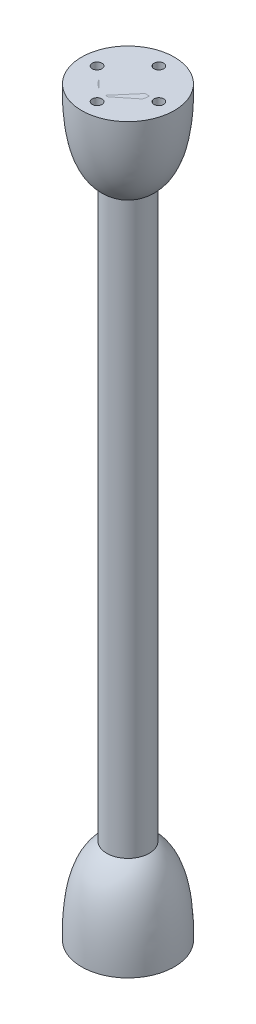
ISO-10303-21;
HEADER;
FILE_DESCRIPTION(('STEP AP214'),'2;1');
FILE_NAME('part.step','',(''),(''),'','','');
FILE_SCHEMA(('AUTOMOTIVE_DESIGN { 1 0 10303 214 1 1 1 1 }'));
ENDSEC;
DATA;
#1=APPLICATION_CONTEXT('core data for automotive mechanical design processes');
#2=APPLICATION_PROTOCOL_DEFINITION('international standard','automotive_design',2000,#1);
#3=PRODUCT_CONTEXT('',#1,'mechanical');
#4=PRODUCT('Part','Part','',(#3));
#5=PRODUCT_RELATED_PRODUCT_CATEGORY('part','',(#4));
#6=PRODUCT_DEFINITION_FORMATION('','',#4);
#7=PRODUCT_DEFINITION_CONTEXT('part definition',#1,'design');
#8=PRODUCT_DEFINITION('design','',#6,#7);
#9=PRODUCT_DEFINITION_SHAPE('','',#8);
#10=(LENGTH_UNIT() NAMED_UNIT(*) SI_UNIT(.MILLI.,.METRE.));
#11=(NAMED_UNIT(*) PLANE_ANGLE_UNIT() SI_UNIT($,.RADIAN.));
#12=(NAMED_UNIT(*) SI_UNIT($,.STERADIAN.) SOLID_ANGLE_UNIT());
#13=UNCERTAINTY_MEASURE_WITH_UNIT(LENGTH_MEASURE(1.E-05),#10,'distance_accuracy_value','');
#14=(GEOMETRIC_REPRESENTATION_CONTEXT(3) GLOBAL_UNCERTAINTY_ASSIGNED_CONTEXT((#13)) GLOBAL_UNIT_ASSIGNED_CONTEXT((#10,
#11,#12)) REPRESENTATION_CONTEXT('',''));
#15=CARTESIAN_POINT('',(0.,0.,0.));
#16=DIRECTION('',(0.,0.,1.));
#17=DIRECTION('',(1.,0.,0.));
#18=AXIS2_PLACEMENT_3D('',#15,#16,#17);
#19=CARTESIAN_POINT('',(0.,266.7,0.));
#20=CARTESIAN_POINT('',(19.7530600429032,267.671645918133,0.));
#21=CARTESIAN_POINT('',(19.05,304.8,0.));
#22=B_SPLINE_CURVE_WITH_KNOTS('',2,(#19,#20,#21),.UNSPECIFIED.,.F.,.F.,(3,3),(0.,1.),.UNSPECIFIED.);
#23=CARTESIAN_POINT('',(0.,0.,0.));
#24=DIRECTION('',(0.,-1.,0.));
#25=AXIS1_PLACEMENT('',#23,#24);
#26=SURFACE_OF_REVOLUTION('',#22,#25);
#27=CARTESIAN_POINT('',(0.,304.8,0.));
#28=DIRECTION('',(0.,-1.,0.));
#29=DIRECTION('',(0.,0.,-1.));
#30=AXIS2_PLACEMENT_3D('',#27,#28,#29);
#31=CIRCLE('',#30,19.05);
#32=CARTESIAN_POINT('',(0.,304.8,-19.05));
#33=VERTEX_POINT('',#32);
#34=EDGE_CURVE('E12',#33,#33,#31,.T.);
#35=ORIENTED_EDGE('',*,*,#34,.T.);
#36=EDGE_LOOP('',(#35));
#37=FACE_BOUND('',#36,.T.);
#38=CARTESIAN_POINT('',(0.,266.7,0.));
#39=VERTEX_POINT('',#38);
#40=VERTEX_LOOP('',#39);
#41=FACE_BOUND('',#40,.T.);
#42=ADVANCED_FACE('F47',(#37,#41),#26,.F.);
#43=CARTESIAN_POINT('',(0.,304.8,0.));
#44=DIRECTION('',(0.,1.,0.));
#45=DIRECTION('',(0.,0.,1.));
#46=AXIS2_PLACEMENT_3D('',#43,#44,#45);
#47=PLANE('',#46);
#48=CARTESIAN_POINT('',(12.7,304.8,0.));
#49=DIRECTION('',(0.,1.,0.));
#50=DIRECTION('',(0.,0.,1.));
#51=AXIS2_PLACEMENT_3D('',#48,#49,#50);
#52=CIRCLE('',#51,2.000000064);
#53=CARTESIAN_POINT('',(12.7,304.8,2.000000064));
#54=VERTEX_POINT('',#53);
#55=EDGE_CURVE('E105',#54,#54,#52,.T.);
#56=ORIENTED_EDGE('',*,*,#55,.F.);
#57=EDGE_LOOP('',(#56));
#58=FACE_BOUND('',#57,.T.);
#59=CARTESIAN_POINT('',(-12.7,304.8,0.));
#60=DIRECTION('',(0.,1.,0.));
#61=DIRECTION('',(0.,0.,1.));
#62=AXIS2_PLACEMENT_3D('',#59,#60,#61);
#63=CIRCLE('',#62,2.000000064);
#64=CARTESIAN_POINT('',(-12.7,304.8,2.000000064));
#65=VERTEX_POINT('',#64);
#66=EDGE_CURVE('E108',#65,#65,#63,.T.);
#67=ORIENTED_EDGE('',*,*,#66,.F.);
#68=EDGE_LOOP('',(#67));
#69=FACE_BOUND('',#68,.T.);
#70=CARTESIAN_POINT('',(0.,304.8,-12.7));
#71=DIRECTION('',(0.,1.,0.));
#72=DIRECTION('',(0.,0.,1.));
#73=AXIS2_PLACEMENT_3D('',#70,#71,#72);
#74=CIRCLE('',#73,2.000000064);
#75=CARTESIAN_POINT('',(0.,304.8,-10.699999936));
#76=VERTEX_POINT('',#75);
#77=EDGE_CURVE('E116',#76,#76,#74,.T.);
#78=ORIENTED_EDGE('',*,*,#77,.F.);
#79=EDGE_LOOP('',(#78));
#80=FACE_BOUND('',#79,.T.);
#81=CARTESIAN_POINT('',(0.,304.8,12.7));
#82=DIRECTION('',(0.,1.,0.));
#83=DIRECTION('',(0.,0.,1.));
#84=AXIS2_PLACEMENT_3D('',#81,#82,#83);
#85=CIRCLE('',#84,2.000000064);
#86=CARTESIAN_POINT('',(0.,304.8,14.700000064));
#87=VERTEX_POINT('',#86);
#88=EDGE_CURVE('E122',#87,#87,#85,.T.);
#89=ORIENTED_EDGE('',*,*,#88,.F.);
#90=EDGE_LOOP('',(#89));
#91=FACE_BOUND('',#90,.T.);
#92=ORIENTED_EDGE('',*,*,#34,.F.);
#93=EDGE_LOOP('',(#92));
#94=FACE_BOUND('',#93,.T.);
#95=ADVANCED_FACE('F57',(#58,#69,#80,#91,#94),#47,.T.);
#96=CARTESIAN_POINT('',(0.,297.80000003,12.7));
#97=DIRECTION('',(0.,1.,0.));
#98=DIRECTION('',(0.,0.,1.));
#99=AXIS2_PLACEMENT_3D('',#96,#97,#98);
#100=CYLINDRICAL_SURFACE('',#99,2.000000064);
#101=CARTESIAN_POINT('',(0.,297.80000003,12.7));
#102=DIRECTION('',(0.,1.,0.));
#103=DIRECTION('',(0.,0.,1.));
#104=AXIS2_PLACEMENT_3D('',#101,#102,#103);
#105=CIRCLE('',#104,2.000000064);
#106=CARTESIAN_POINT('',(0.,297.80000003,14.700000064));
#107=VERTEX_POINT('',#106);
#108=EDGE_CURVE('E125',#107,#107,#105,.T.);
#109=ORIENTED_EDGE('',*,*,#108,.F.);
#110=EDGE_LOOP('',(#109));
#111=FACE_BOUND('',#110,.T.);
#112=ORIENTED_EDGE('',*,*,#88,.T.);
#113=EDGE_LOOP('',(#112));
#114=FACE_BOUND('',#113,.T.);
#115=ADVANCED_FACE('F62',(#111,#114),#100,.F.);
#116=CARTESIAN_POINT('',(0.,297.80000003,12.7));
#117=DIRECTION('',(0.,1.,0.));
#118=DIRECTION('',(0.,0.,1.));
#119=AXIS2_PLACEMENT_3D('',#116,#117,#118);
#120=PLANE('',#119);
#121=ORIENTED_EDGE('',*,*,#108,.T.);
#122=EDGE_LOOP('',(#121));
#123=FACE_BOUND('',#122,.T.);
#124=ADVANCED_FACE('F69',(#123),#120,.T.);
#125=CARTESIAN_POINT('',(0.,297.80000003,-12.7));
#126=DIRECTION('',(0.,1.,0.));
#127=DIRECTION('',(0.,0.,1.));
#128=AXIS2_PLACEMENT_3D('',#125,#126,#127);
#129=CYLINDRICAL_SURFACE('',#128,2.000000064);
#130=CARTESIAN_POINT('',(0.,297.80000003,-12.7));
#131=DIRECTION('',(0.,1.,0.));
#132=DIRECTION('',(0.,0.,1.));
#133=AXIS2_PLACEMENT_3D('',#130,#131,#132);
#134=CIRCLE('',#133,2.000000064);
#135=CARTESIAN_POINT('',(0.,297.80000003,-10.699999936));
#136=VERTEX_POINT('',#135);
#137=EDGE_CURVE('E119',#136,#136,#134,.T.);
#138=ORIENTED_EDGE('',*,*,#137,.F.);
#139=EDGE_LOOP('',(#138));
#140=FACE_BOUND('',#139,.T.);
#141=ORIENTED_EDGE('',*,*,#77,.T.);
#142=EDGE_LOOP('',(#141));
#143=FACE_BOUND('',#142,.T.);
#144=ADVANCED_FACE('F76',(#140,#143),#129,.F.);
#145=CARTESIAN_POINT('',(0.,297.80000003,-12.7));
#146=DIRECTION('',(0.,1.,0.));
#147=DIRECTION('',(0.,0.,1.));
#148=AXIS2_PLACEMENT_3D('',#145,#146,#147);
#149=PLANE('',#148);
#150=ORIENTED_EDGE('',*,*,#137,.T.);
#151=EDGE_LOOP('',(#150));
#152=FACE_BOUND('',#151,.T.);
#153=ADVANCED_FACE('F79',(#152),#149,.T.);
#154=CARTESIAN_POINT('',(-12.7,297.80000003,0.));
#155=DIRECTION('',(0.,1.,0.));
#156=DIRECTION('',(0.,0.,1.));
#157=AXIS2_PLACEMENT_3D('',#154,#155,#156);
#158=CYLINDRICAL_SURFACE('',#157,2.000000064);
#159=CARTESIAN_POINT('',(-12.7,297.80000003,0.));
#160=DIRECTION('',(0.,1.,0.));
#161=DIRECTION('',(0.,0.,1.));
#162=AXIS2_PLACEMENT_3D('',#159,#160,#161);
#163=CIRCLE('',#162,2.000000064);
#164=CARTESIAN_POINT('',(-12.7,297.80000003,2.000000064));
#165=VERTEX_POINT('',#164);
#166=EDGE_CURVE('E113',#165,#165,#163,.T.);
#167=ORIENTED_EDGE('',*,*,#166,.F.);
#168=EDGE_LOOP('',(#167));
#169=FACE_BOUND('',#168,.T.);
#170=ORIENTED_EDGE('',*,*,#66,.T.);
#171=EDGE_LOOP('',(#170));
#172=FACE_BOUND('',#171,.T.);
#173=ADVANCED_FACE('F82',(#169,#172),#158,.F.);
#174=CARTESIAN_POINT('',(-12.7,297.80000003,0.));
#175=DIRECTION('',(0.,1.,0.));
#176=DIRECTION('',(0.,0.,1.));
#177=AXIS2_PLACEMENT_3D('',#174,#175,#176);
#178=PLANE('',#177);
#179=ORIENTED_EDGE('',*,*,#166,.T.);
#180=EDGE_LOOP('',(#179));
#181=FACE_BOUND('',#180,.T.);
#182=ADVANCED_FACE('F87',(#181),#178,.T.);
#183=CARTESIAN_POINT('',(12.7,297.80000003,0.));
#184=DIRECTION('',(0.,1.,0.));
#185=DIRECTION('',(0.,0.,1.));
#186=AXIS2_PLACEMENT_3D('',#183,#184,#185);
#187=CYLINDRICAL_SURFACE('',#186,2.000000064);
#188=CARTESIAN_POINT('',(12.7,297.80000003,0.));
#189=DIRECTION('',(0.,1.,0.));
#190=DIRECTION('',(0.,0.,1.));
#191=AXIS2_PLACEMENT_3D('',#188,#189,#190);
#192=CIRCLE('',#191,2.000000064);
#193=CARTESIAN_POINT('',(12.7,297.80000003,2.000000064));
#194=VERTEX_POINT('',#193);
#195=EDGE_CURVE('E53',#194,#194,#192,.T.);
#196=ORIENTED_EDGE('',*,*,#195,.F.);
#197=EDGE_LOOP('',(#196));
#198=FACE_BOUND('',#197,.T.);
#199=ORIENTED_EDGE('',*,*,#55,.T.);
#200=EDGE_LOOP('',(#199));
#201=FACE_BOUND('',#200,.T.);
#202=ADVANCED_FACE('F90',(#198,#201),#187,.F.);
#203=CARTESIAN_POINT('',(12.7,297.80000003,0.));
#204=DIRECTION('',(0.,1.,0.));
#205=DIRECTION('',(0.,0.,1.));
#206=AXIS2_PLACEMENT_3D('',#203,#204,#205);
#207=PLANE('',#206);
#208=ORIENTED_EDGE('',*,*,#195,.T.);
#209=EDGE_LOOP('',(#208));
#210=FACE_BOUND('',#209,.T.);
#211=ADVANCED_FACE('F97',(#210),#207,.T.);
#212=CLOSED_SHELL('',(#42,#95,#115,#124,#144,#153,#173,#182,#202,#211));
#213=MANIFOLD_SOLID_BREP('B2',#212);
#214=CARTESIAN_POINT('',(0.,0.,0.));
#215=DIRECTION('',(0.,-1.,0.));
#216=DIRECTION('',(0.,0.,-1.));
#217=AXIS2_PLACEMENT_3D('',#214,#215,#216);
#218=PLANE('',#217);
#219=CARTESIAN_POINT('',(12.7,0.,0.));
#220=DIRECTION('',(0.,-1.,0.));
#221=DIRECTION('',(0.,0.,-1.));
#222=AXIS2_PLACEMENT_3D('',#219,#220,#221);
#223=CIRCLE('',#222,2.000000064);
#224=CARTESIAN_POINT('',(12.7,0.,-2.000000064));
#225=VERTEX_POINT('',#224);
#226=EDGE_CURVE('E278',#225,#225,#223,.T.);
#227=ORIENTED_EDGE('',*,*,#226,.F.);
#228=EDGE_LOOP('',(#227));
#229=FACE_BOUND('',#228,.T.);
#230=CARTESIAN_POINT('',(-12.7,0.,0.));
#231=DIRECTION('',(0.,-1.,0.));
#232=DIRECTION('',(0.,0.,-1.));
#233=AXIS2_PLACEMENT_3D('',#230,#231,#232);
#234=CIRCLE('',#233,2.000000064);
#235=CARTESIAN_POINT('',(-12.7,0.,-2.000000064));
#236=VERTEX_POINT('',#235);
#237=EDGE_CURVE('E282',#236,#236,#234,.T.);
#238=ORIENTED_EDGE('',*,*,#237,.F.);
#239=EDGE_LOOP('',(#238));
#240=FACE_BOUND('',#239,.T.);
#241=CARTESIAN_POINT('',(0.,0.,12.7));
#242=DIRECTION('',(0.,-1.,0.));
#243=DIRECTION('',(0.,0.,-1.));
#244=AXIS2_PLACEMENT_3D('',#241,#242,#243);
#245=CIRCLE('',#244,2.000000064);
#246=CARTESIAN_POINT('',(0.,0.,10.699999936));
#247=VERTEX_POINT('',#246);
#248=EDGE_CURVE('E286',#247,#247,#245,.T.);
#249=ORIENTED_EDGE('',*,*,#248,.F.);
#250=EDGE_LOOP('',(#249));
#251=FACE_BOUND('',#250,.T.);
#252=CARTESIAN_POINT('',(0.,0.,-12.7));
#253=DIRECTION('',(0.,-1.,0.));
#254=DIRECTION('',(0.,0.,-1.));
#255=AXIS2_PLACEMENT_3D('',#252,#253,#254);
#256=CIRCLE('',#255,2.000000064);
#257=CARTESIAN_POINT('',(0.,0.,-14.700000064));
#258=VERTEX_POINT('',#257);
#259=EDGE_CURVE('E289',#258,#258,#256,.T.);
#260=ORIENTED_EDGE('',*,*,#259,.F.);
#261=EDGE_LOOP('',(#260));
#262=FACE_BOUND('',#261,.T.);
#263=CARTESIAN_POINT('',(0.,0.,0.));
#264=DIRECTION('',(0.,-1.,0.));
#265=DIRECTION('',(0.,0.,-1.));
#266=AXIS2_PLACEMENT_3D('',#263,#264,#265);
#267=CIRCLE('',#266,19.05);
#268=CARTESIAN_POINT('',(0.,0.,-19.05));
#269=VERTEX_POINT('',#268);
#270=EDGE_CURVE('E208',#269,#269,#267,.T.);
#271=ORIENTED_EDGE('',*,*,#270,.T.);
#272=EDGE_LOOP('',(#271));
#273=FACE_BOUND('',#272,.T.);
#274=ADVANCED_FACE('F202',(#229,#240,#251,#262,#273),#218,.T.);
#275=CARTESIAN_POINT('',(19.05,0.,0.));
#276=CARTESIAN_POINT('',(19.7530600429032,37.128354081867,0.));
#277=CARTESIAN_POINT('',(0.,38.1,0.));
#278=B_SPLINE_CURVE_WITH_KNOTS('',2,(#275,#276,#277),.UNSPECIFIED.,.F.,.F.,(3,3),(0.,1.),.UNSPECIFIED.);
#279=CARTESIAN_POINT('',(0.,0.,0.));
#280=DIRECTION('',(0.,-1.,0.));
#281=AXIS1_PLACEMENT('',#279,#280);
#282=SURFACE_OF_REVOLUTION('',#278,#281);
#283=CARTESIAN_POINT('',(0.,35.2622308884157,0.));
#284=DIRECTION('',(0.,-1.,0.));
#285=DIRECTION('',(0.,0.,-1.));
#286=AXIS2_PLACEMENT_3D('',#283,#284,#285);
#287=CIRCLE('',#286,8.73125);
#288=CARTESIAN_POINT('',(0.,35.2622308884157,-8.73125));
#289=VERTEX_POINT('',#288);
#290=EDGE_CURVE('E46',#289,#289,#287,.F.);
#291=ORIENTED_EDGE('',*,*,#290,.F.);
#292=EDGE_LOOP('',(#291));
#293=FACE_BOUND('',#292,.T.);
#294=ORIENTED_EDGE('',*,*,#270,.F.);
#295=EDGE_LOOP('',(#294));
#296=FACE_BOUND('',#295,.T.);
#297=ADVANCED_FACE('F226',(#293,#296),#282,.F.);
#298=CARTESIAN_POINT('',(0.,304.8,0.));
#299=DIRECTION('',(0.,-1.,0.));
#300=DIRECTION('',(0.,0.,-1.));
#301=AXIS2_PLACEMENT_3D('',#298,#299,#300);
#302=CYLINDRICAL_SURFACE('',#301,8.73125);
#303=CARTESIAN_POINT('',(0.,304.8,0.));
#304=DIRECTION('',(0.,-1.,0.));
#305=DIRECTION('',(0.,0.,-1.));
#306=AXIS2_PLACEMENT_3D('',#303,#304,#305);
#307=CIRCLE('',#306,8.73125);
#308=CARTESIAN_POINT('',(0.,304.8,-8.73125));
#309=VERTEX_POINT('',#308);
#310=EDGE_CURVE('E212',#309,#309,#307,.T.);
#311=CARTESIAN_POINT('',(0.,35.2622308884157,-8.73125));
#312=CARTESIAN_POINT('',(0.,38.0699159833281,-8.73125));
#313=CARTESIAN_POINT('',(0.,40.8776010782404,-8.73125));
#314=CARTESIAN_POINT('',(0.,46.4929712680651,-8.73125));
#315=CARTESIAN_POINT('',(0.,49.3006563629774,-8.73125));
#316=CARTESIAN_POINT('',(0.,54.9160265528021,-8.73125));
#317=CARTESIAN_POINT('',(0.,57.7237116477144,-8.73125));
#318=CARTESIAN_POINT('',(0.,63.3390818375391,-8.73125));
#319=CARTESIAN_POINT('',(0.,66.1467669324514,-8.73125));
#320=CARTESIAN_POINT('',(0.,71.7621371222761,-8.73125));
#321=CARTESIAN_POINT('',(0.,74.5698222171884,-8.73125));
#322=CARTESIAN_POINT('',(0.,80.1851924070131,-8.73125));
#323=CARTESIAN_POINT('',(0.,82.9928775019254,-8.73125));
#324=CARTESIAN_POINT('',(0.,88.6082476917501,-8.73125));
#325=CARTESIAN_POINT('',(0.,91.4159327866624,-8.73125));
#326=CARTESIAN_POINT('',(0.,97.0313029764871,-8.73125));
#327=CARTESIAN_POINT('',(0.,99.8389880713994,-8.73125));
#328=CARTESIAN_POINT('',(0.,105.454358261224,-8.73125));
#329=CARTESIAN_POINT('',(0.,108.262043356136,-8.73125));
#330=CARTESIAN_POINT('',(0.,113.877413545961,-8.73125));
#331=CARTESIAN_POINT('',(0.,116.685098640873,-8.73125));
#332=CARTESIAN_POINT('',(0.,122.300468830698,-8.73125));
#333=CARTESIAN_POINT('',(0.,125.10815392561,-8.73125));
#334=CARTESIAN_POINT('',(0.,130.723524115435,-8.73125));
#335=CARTESIAN_POINT('',(0.,133.531209210347,-8.73125));
#336=CARTESIAN_POINT('',(0.,139.146579400172,-8.73125));
#337=CARTESIAN_POINT('',(0.,141.954264495085,-8.73125));
#338=CARTESIAN_POINT('',(0.,147.569634684909,-8.73125));
#339=CARTESIAN_POINT('',(0.,150.377319779822,-8.73125));
#340=CARTESIAN_POINT('',(0.,155.992689969646,-8.73125));
#341=CARTESIAN_POINT('',(0.,158.800375064559,-8.73125));
#342=CARTESIAN_POINT('',(0.,164.415745254383,-8.73125));
#343=CARTESIAN_POINT('',(0.,167.223430349296,-8.73125));
#344=CARTESIAN_POINT('',(0.,172.83880053912,-8.73125));
#345=CARTESIAN_POINT('',(0.,175.646485634033,-8.73125));
#346=CARTESIAN_POINT('',(0.,181.261855823857,-8.73125));
#347=CARTESIAN_POINT('',(0.,184.06954091877,-8.73125));
#348=CARTESIAN_POINT('',(0.,189.684911108594,-8.73125));
#349=CARTESIAN_POINT('',(0.,192.492596203507,-8.73125));
#350=CARTESIAN_POINT('',(0.,198.107966393331,-8.73125));
#351=CARTESIAN_POINT('',(0.,200.915651488244,-8.73125));
#352=CARTESIAN_POINT('',(0.,206.531021678068,-8.73125));
#353=CARTESIAN_POINT('',(0.,209.338706772981,-8.73125));
#354=CARTESIAN_POINT('',(0.,214.954076962805,-8.73125));
#355=CARTESIAN_POINT('',(0.,217.761762057718,-8.73125));
#356=CARTESIAN_POINT('',(0.,223.377132247542,-8.73125));
#357=CARTESIAN_POINT('',(0.,226.184817342455,-8.73125));
#358=CARTESIAN_POINT('',(0.,231.800187532279,-8.73125));
#359=CARTESIAN_POINT('',(0.,234.607872627192,-8.73125));
#360=CARTESIAN_POINT('',(0.,240.223242817016,-8.73125));
#361=CARTESIAN_POINT('',(0.,243.030927911929,-8.73125));
#362=CARTESIAN_POINT('',(0.,248.646298101753,-8.73125));
#363=CARTESIAN_POINT('',(0.,251.453983196666,-8.73125));
#364=CARTESIAN_POINT('',(0.,257.06935338649,-8.73125));
#365=CARTESIAN_POINT('',(0.,259.877038481403,-8.73125));
#366=CARTESIAN_POINT('',(0.,265.492408671227,-8.73125));
#367=CARTESIAN_POINT('',(0.,268.30009376614,-8.73125));
#368=CARTESIAN_POINT('',(0.,273.915463955964,-8.73125));
#369=CARTESIAN_POINT('',(0.,276.723149050877,-8.73125));
#370=CARTESIAN_POINT('',(0.,282.338519240701,-8.73125));
#371=CARTESIAN_POINT('',(0.,285.146204335614,-8.73125));
#372=CARTESIAN_POINT('',(0.,290.761574525438,-8.73125));
#373=CARTESIAN_POINT('',(0.,293.569259620351,-8.73125));
#374=CARTESIAN_POINT('',(0.,299.184629810175,-8.73125));
#375=CARTESIAN_POINT('',(0.,301.992314905088,-8.73125));
#376=CARTESIAN_POINT('',(0.,304.8,-8.73125));
#377=B_SPLINE_CURVE_WITH_KNOTS('',3,(#311,#312,#313,#314,#315,#316,#317,#318,#319,#320,#321,
#322,#323,#324,#325,#326,#327,#328,#329,#330,#331,#332,#333,#334,#335,#336,#337,#338,#339,#340,
#341,#342,#343,#344,#345,#346,#347,#348,#349,#350,#351,#352,#353,#354,#355,#356,#357,#358,#359,
#360,#361,#362,#363,#364,#365,#366,#367,#368,#369,#370,#371,#372,#373,#374,#375,#376),
.UNSPECIFIED.,.F.,.F.,(4,2,2,2,2,2,2,2,2,2,2,2,2,2,2,2,2,2,2,2,2,2,2,2,2,2,2,2,2,2,2,2,4),(0.,
8.42305528473702,16.846110569474,25.269165854211,33.692221138948,42.115276423685,
50.538331708422,58.961386993159,67.3844422778961,75.8074975626331,84.2305528473701,
92.6536081321071,101.076663416844,109.499718701581,117.922773986318,126.345829271055,
134.768884555792,143.191939840529,151.614995125266,160.038050410003,168.46110569474,
176.884160979477,185.307216264214,193.730271548951,202.153326833688,210.576382118425,
218.999437403162,227.422492687899,235.845547972636,244.268603257373,252.69165854211,
261.114713826847,269.537769111584),.UNSPECIFIED.);
#378=EDGE_CURVE('BSEAM229',#289,#309,#377,.T.);
#379=ORIENTED_EDGE('',*,*,#290,.T.);
#380=ORIENTED_EDGE('',*,*,#310,.T.);
#381=ORIENTED_EDGE('',*,*,#378,.T.);
#382=ORIENTED_EDGE('',*,*,#378,.F.);
#383=EDGE_LOOP('',(#379,#381,#380,#382));
#384=FACE_BOUND('',#383,.T.);
#385=ADVANCED_FACE('F229',(#384),#302,.T.);
#386=CARTESIAN_POINT('',(0.,304.8,0.));
#387=DIRECTION('',(0.,-1.,0.));
#388=DIRECTION('',(0.,0.,-1.));
#389=AXIS2_PLACEMENT_3D('',#386,#387,#388);
#390=PLANE('',#389);
#391=ORIENTED_EDGE('',*,*,#310,.F.);
#392=EDGE_LOOP('',(#391));
#393=FACE_BOUND('',#392,.T.);
#394=ADVANCED_FACE('F233',(#393),#390,.F.);
#395=CARTESIAN_POINT('',(0.,6.99999997,-12.7));
#396=DIRECTION('',(0.,-1.,0.));
#397=DIRECTION('',(0.,0.,-1.));
#398=AXIS2_PLACEMENT_3D('',#395,#396,#397);
#399=CYLINDRICAL_SURFACE('',#398,2.000000064);
#400=CARTESIAN_POINT('',(0.,6.99999997,-12.7));
#401=DIRECTION('',(0.,-1.,0.));
#402=DIRECTION('',(0.,0.,-1.));
#403=AXIS2_PLACEMENT_3D('',#400,#401,#402);
#404=CIRCLE('',#403,2.000000064);
#405=CARTESIAN_POINT('',(0.,6.99999997,-14.700000064));
#406=VERTEX_POINT('',#405);
#407=EDGE_CURVE('E292',#406,#406,#404,.T.);
#408=ORIENTED_EDGE('',*,*,#407,.F.);
#409=EDGE_LOOP('',(#408));
#410=FACE_BOUND('',#409,.T.);
#411=ORIENTED_EDGE('',*,*,#259,.T.);
#412=EDGE_LOOP('',(#411));
#413=FACE_BOUND('',#412,.T.);
#414=ADVANCED_FACE('F236',(#410,#413),#399,.F.);
#415=CARTESIAN_POINT('',(0.,6.99999997,-12.7));
#416=DIRECTION('',(0.,-1.,0.));
#417=DIRECTION('',(0.,0.,-1.));
#418=AXIS2_PLACEMENT_3D('',#415,#416,#417);
#419=PLANE('',#418);
#420=ORIENTED_EDGE('',*,*,#407,.T.);
#421=EDGE_LOOP('',(#420));
#422=FACE_BOUND('',#421,.T.);
#423=ADVANCED_FACE('F238',(#422),#419,.T.);
#424=CARTESIAN_POINT('',(0.,6.99999997,12.7));
#425=DIRECTION('',(0.,-1.,0.));
#426=DIRECTION('',(0.,0.,-1.));
#427=AXIS2_PLACEMENT_3D('',#424,#425,#426);
#428=CYLINDRICAL_SURFACE('',#427,2.000000064);
#429=CARTESIAN_POINT('',(0.,6.99999997,12.7));
#430=DIRECTION('',(0.,-1.,0.));
#431=DIRECTION('',(0.,0.,-1.));
#432=AXIS2_PLACEMENT_3D('',#429,#430,#431);
#433=CIRCLE('',#432,2.000000064);
#434=CARTESIAN_POINT('',(0.,6.99999997,10.699999936));
#435=VERTEX_POINT('',#434);
#436=EDGE_CURVE('E291',#435,#435,#433,.T.);
#437=ORIENTED_EDGE('',*,*,#436,.F.);
#438=EDGE_LOOP('',(#437));
#439=FACE_BOUND('',#438,.T.);
#440=ORIENTED_EDGE('',*,*,#248,.T.);
#441=EDGE_LOOP('',(#440));
#442=FACE_BOUND('',#441,.T.);
#443=ADVANCED_FACE('F241',(#439,#442),#428,.F.);
#444=CARTESIAN_POINT('',(0.,6.99999997,12.7));
#445=DIRECTION('',(0.,-1.,0.));
#446=DIRECTION('',(0.,0.,-1.));
#447=AXIS2_PLACEMENT_3D('',#444,#445,#446);
#448=PLANE('',#447);
#449=ORIENTED_EDGE('',*,*,#436,.T.);
#450=EDGE_LOOP('',(#449));
#451=FACE_BOUND('',#450,.T.);
#452=ADVANCED_FACE('F246',(#451),#448,.T.);
#453=CARTESIAN_POINT('',(-12.7,6.99999997,0.));
#454=DIRECTION('',(0.,-1.,0.));
#455=DIRECTION('',(0.,0.,-1.));
#456=AXIS2_PLACEMENT_3D('',#453,#454,#455);
#457=CYLINDRICAL_SURFACE('',#456,2.000000064);
#458=CARTESIAN_POINT('',(-12.7,6.99999997,0.));
#459=DIRECTION('',(0.,-1.,0.));
#460=DIRECTION('',(0.,0.,-1.));
#461=AXIS2_PLACEMENT_3D('',#458,#459,#460);
#462=CIRCLE('',#461,2.000000064);
#463=CARTESIAN_POINT('',(-12.7,6.99999997,-2.000000064));
#464=VERTEX_POINT('',#463);
#465=EDGE_CURVE('E299',#464,#464,#462,.T.);
#466=ORIENTED_EDGE('',*,*,#465,.F.);
#467=EDGE_LOOP('',(#466));
#468=FACE_BOUND('',#467,.T.);
#469=ORIENTED_EDGE('',*,*,#237,.T.);
#470=EDGE_LOOP('',(#469));
#471=FACE_BOUND('',#470,.T.);
#472=ADVANCED_FACE('F249',(#468,#471),#457,.F.);
#473=CARTESIAN_POINT('',(-12.7,6.99999997,0.));
#474=DIRECTION('',(0.,-1.,0.));
#475=DIRECTION('',(0.,0.,-1.));
#476=AXIS2_PLACEMENT_3D('',#473,#474,#475);
#477=PLANE('',#476);
#478=ORIENTED_EDGE('',*,*,#465,.T.);
#479=EDGE_LOOP('',(#478));
#480=FACE_BOUND('',#479,.T.);
#481=ADVANCED_FACE('F254',(#480),#477,.T.);
#482=CARTESIAN_POINT('',(12.7,6.99999997,0.));
#483=DIRECTION('',(0.,-1.,0.));
#484=DIRECTION('',(0.,0.,-1.));
#485=AXIS2_PLACEMENT_3D('',#482,#483,#484);
#486=CYLINDRICAL_SURFACE('',#485,2.000000064);
#487=CARTESIAN_POINT('',(12.7,6.99999997,0.));
#488=DIRECTION('',(0.,-1.,0.));
#489=DIRECTION('',(0.,0.,-1.));
#490=AXIS2_PLACEMENT_3D('',#487,#488,#489);
#491=CIRCLE('',#490,2.000000064);
#492=CARTESIAN_POINT('',(12.7,6.99999997,-2.000000064));
#493=VERTEX_POINT('',#492);
#494=EDGE_CURVE('E216',#493,#493,#491,.T.);
#495=ORIENTED_EDGE('',*,*,#494,.F.);
#496=EDGE_LOOP('',(#495));
#497=FACE_BOUND('',#496,.T.);
#498=ORIENTED_EDGE('',*,*,#226,.T.);
#499=EDGE_LOOP('',(#498));
#500=FACE_BOUND('',#499,.T.);
#501=ADVANCED_FACE('F257',(#497,#500),#486,.F.);
#502=CARTESIAN_POINT('',(12.7,6.99999997,0.));
#503=DIRECTION('',(0.,-1.,0.));
#504=DIRECTION('',(0.,0.,-1.));
#505=AXIS2_PLACEMENT_3D('',#502,#503,#504);
#506=PLANE('',#505);
#507=ORIENTED_EDGE('',*,*,#494,.T.);
#508=EDGE_LOOP('',(#507));
#509=FACE_BOUND('',#508,.T.);
#510=ADVANCED_FACE('F264',(#509),#506,.T.);
#511=CLOSED_SHELL('',(#274,#297,#385,#394,#414,#423,#443,#452,#472,#481,#501,#510));
#512=MANIFOLD_SOLID_BREP('B6',#511);
#513=ADVANCED_BREP_SHAPE_REPRESENTATION('',(#18,#213,#512),#14);
#514=SHAPE_DEFINITION_REPRESENTATION(#9,#513);
ENDSEC;
END-ISO-10303-21;
